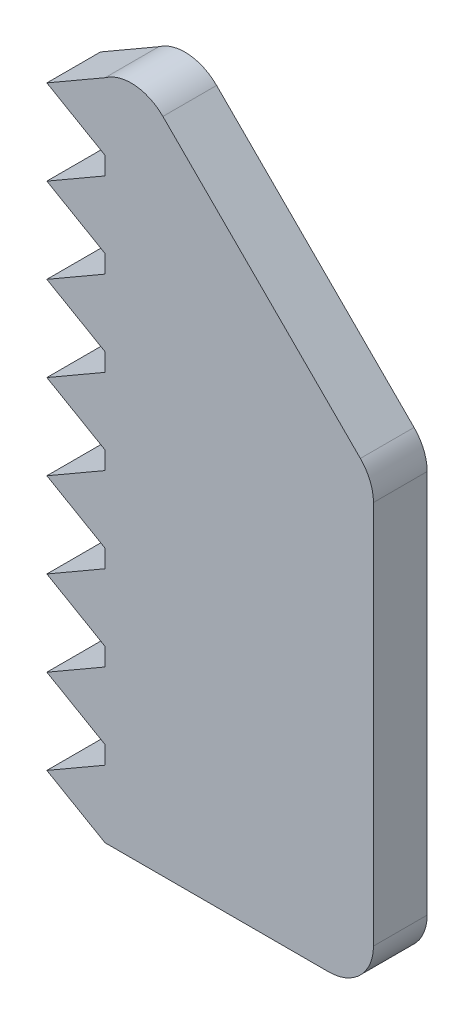
ISO-10303-21;
HEADER;
FILE_DESCRIPTION(('STEP AP214'),'2;1');
FILE_NAME('part.step','',(''),(''),'','','');
FILE_SCHEMA(('AUTOMOTIVE_DESIGN { 1 0 10303 214 1 1 1 1 }'));
ENDSEC;
DATA;
#1=APPLICATION_CONTEXT('core data for automotive mechanical design processes');
#2=APPLICATION_PROTOCOL_DEFINITION('international standard','automotive_design',2000,#1);
#3=PRODUCT_CONTEXT('',#1,'mechanical');
#4=PRODUCT('Part','Part','',(#3));
#5=PRODUCT_RELATED_PRODUCT_CATEGORY('part','',(#4));
#6=PRODUCT_DEFINITION_FORMATION('','',#4);
#7=PRODUCT_DEFINITION_CONTEXT('part definition',#1,'design');
#8=PRODUCT_DEFINITION('design','',#6,#7);
#9=PRODUCT_DEFINITION_SHAPE('','',#8);
#10=(LENGTH_UNIT() NAMED_UNIT(*) SI_UNIT(.MILLI.,.METRE.));
#11=(NAMED_UNIT(*) PLANE_ANGLE_UNIT() SI_UNIT($,.RADIAN.));
#12=(NAMED_UNIT(*) SI_UNIT($,.STERADIAN.) SOLID_ANGLE_UNIT());
#13=UNCERTAINTY_MEASURE_WITH_UNIT(LENGTH_MEASURE(1.E-05),#10,'distance_accuracy_value','');
#14=(GEOMETRIC_REPRESENTATION_CONTEXT(3) GLOBAL_UNCERTAINTY_ASSIGNED_CONTEXT((#13)) GLOBAL_UNIT_ASSIGNED_CONTEXT((#10,
#11,#12)) REPRESENTATION_CONTEXT('',''));
#15=CARTESIAN_POINT('',(0.,0.,0.));
#16=DIRECTION('',(0.,0.,1.));
#17=DIRECTION('',(1.,0.,0.));
#18=AXIS2_PLACEMENT_3D('',#15,#16,#17);
#19=CARTESIAN_POINT('',(0.,20.,3.));
#20=DIRECTION('',(1.,0.,0.));
#21=DIRECTION('',(0.,0.,-1.));
#22=AXIS2_PLACEMENT_3D('',#19,#20,#21);
#23=PLANE('',#22);
#24=DIRECTION('',(0.,-1.,0.));
#25=VECTOR('',#24,1.);
#26=CARTESIAN_POINT('',(0.,20.,3.));
#27=LINE('',#26,#25);
#28=CARTESIAN_POINT('',(0.,86.5388744962558,3.));
#29=VERTEX_POINT('',#28);
#30=CARTESIAN_POINT('',(0.,84.5388744962559,3.));
#31=VERTEX_POINT('',#30);
#32=EDGE_CURVE('E243',#29,#31,#27,.T.);
#33=ORIENTED_EDGE('',*,*,#32,.F.);
#34=DIRECTION('',(0.,0.,1.));
#35=VECTOR('',#34,1.);
#36=CARTESIAN_POINT('',(0.,86.5388744962558,-3.));
#37=LINE('',#36,#35);
#38=CARTESIAN_POINT('',(0.,86.5388744962558,-3.));
#39=VERTEX_POINT('',#38);
#40=EDGE_CURVE('E242',#39,#29,#37,.T.);
#41=ORIENTED_EDGE('',*,*,#40,.F.);
#42=DIRECTION('',(0.,-1.,0.));
#43=VECTOR('',#42,1.);
#44=CARTESIAN_POINT('',(0.,20.,-3.));
#45=LINE('',#44,#43);
#46=CARTESIAN_POINT('',(0.,84.5388744962559,-3.));
#47=VERTEX_POINT('',#46);
#48=EDGE_CURVE('E224',#39,#47,#45,.T.);
#49=ORIENTED_EDGE('',*,*,#48,.T.);
#50=DIRECTION('',(0.,0.,1.));
#51=VECTOR('',#50,1.);
#52=CARTESIAN_POINT('',(0.,84.5388744962559,-3.));
#53=LINE('',#52,#51);
#54=EDGE_CURVE('E277',#47,#31,#53,.T.);
#55=ORIENTED_EDGE('',*,*,#54,.T.);
#56=EDGE_LOOP('',(#33,#41,#49,#55));
#57=FACE_BOUND('',#56,.T.);
#58=ADVANCED_FACE('F32',(#57),#23,.F.);
#59=CARTESIAN_POINT('',(0.,77.0333209967907,3.));
#60=VERTEX_POINT('',#59);
#61=CARTESIAN_POINT('',(0.,75.0333209967907,3.));
#62=VERTEX_POINT('',#61);
#63=EDGE_CURVE('E404',#60,#62,#27,.T.);
#64=ORIENTED_EDGE('',*,*,#63,.F.);
#65=DIRECTION('',(0.,0.,1.));
#66=VECTOR('',#65,1.);
#67=CARTESIAN_POINT('',(0.,77.0333209967907,-3.));
#68=LINE('',#67,#66);
#69=CARTESIAN_POINT('',(0.,77.0333209967907,-3.));
#70=VERTEX_POINT('',#69);
#71=EDGE_CURVE('E269',#70,#60,#68,.T.);
#72=ORIENTED_EDGE('',*,*,#71,.F.);
#73=CARTESIAN_POINT('',(0.,75.0333209967907,-3.));
#74=VERTEX_POINT('',#73);
#75=EDGE_CURVE('E238',#70,#74,#45,.T.);
#76=ORIENTED_EDGE('',*,*,#75,.T.);
#77=DIRECTION('',(0.,0.,1.));
#78=VECTOR('',#77,1.);
#79=CARTESIAN_POINT('',(0.,75.0333209967907,-3.));
#80=LINE('',#79,#78);
#81=EDGE_CURVE('E296',#74,#62,#80,.T.);
#82=ORIENTED_EDGE('',*,*,#81,.T.);
#83=EDGE_LOOP('',(#64,#72,#76,#82));
#84=FACE_BOUND('',#83,.T.);
#85=ADVANCED_FACE('F465',(#84),#23,.F.);
#86=CARTESIAN_POINT('',(0.,67.5277674973256,3.));
#87=VERTEX_POINT('',#86);
#88=CARTESIAN_POINT('',(0.,65.5277674973256,3.));
#89=VERTEX_POINT('',#88);
#90=EDGE_CURVE('E463',#87,#89,#27,.T.);
#91=ORIENTED_EDGE('',*,*,#90,.F.);
#92=DIRECTION('',(0.,0.,1.));
#93=VECTOR('',#92,1.);
#94=CARTESIAN_POINT('',(0.,67.5277674973256,-3.));
#95=LINE('',#94,#93);
#96=CARTESIAN_POINT('',(0.,67.5277674973256,-3.));
#97=VERTEX_POINT('',#96);
#98=EDGE_CURVE('E288',#97,#87,#95,.T.);
#99=ORIENTED_EDGE('',*,*,#98,.F.);
#100=CARTESIAN_POINT('',(0.,65.5277674973256,-3.));
#101=VERTEX_POINT('',#100);
#102=EDGE_CURVE('E479',#97,#101,#45,.T.);
#103=ORIENTED_EDGE('',*,*,#102,.T.);
#104=DIRECTION('',(0.,0.,1.));
#105=VECTOR('',#104,1.);
#106=CARTESIAN_POINT('',(0.,65.5277674973256,-3.));
#107=LINE('',#106,#105);
#108=EDGE_CURVE('E316',#101,#89,#107,.T.);
#109=ORIENTED_EDGE('',*,*,#108,.T.);
#110=EDGE_LOOP('',(#91,#99,#103,#109));
#111=FACE_BOUND('',#110,.T.);
#112=ADVANCED_FACE('F478',(#111),#23,.F.);
#113=CARTESIAN_POINT('',(0.,58.0222139978605,3.));
#114=VERTEX_POINT('',#113);
#115=CARTESIAN_POINT('',(0.,56.0222139978605,3.));
#116=VERTEX_POINT('',#115);
#117=EDGE_CURVE('E476',#114,#116,#27,.T.);
#118=ORIENTED_EDGE('',*,*,#117,.F.);
#119=DIRECTION('',(0.,0.,1.));
#120=VECTOR('',#119,1.);
#121=CARTESIAN_POINT('',(0.,58.0222139978605,-3.));
#122=LINE('',#121,#120);
#123=CARTESIAN_POINT('',(0.,58.0222139978605,-3.));
#124=VERTEX_POINT('',#123);
#125=EDGE_CURVE('E308',#124,#114,#122,.T.);
#126=ORIENTED_EDGE('',*,*,#125,.F.);
#127=CARTESIAN_POINT('',(0.,56.0222139978605,-3.));
#128=VERTEX_POINT('',#127);
#129=EDGE_CURVE('E493',#124,#128,#45,.T.);
#130=ORIENTED_EDGE('',*,*,#129,.T.);
#131=DIRECTION('',(0.,0.,1.));
#132=VECTOR('',#131,1.);
#133=CARTESIAN_POINT('',(0.,56.0222139978605,-3.));
#134=LINE('',#133,#132);
#135=EDGE_CURVE('E336',#128,#116,#134,.T.);
#136=ORIENTED_EDGE('',*,*,#135,.T.);
#137=EDGE_LOOP('',(#118,#126,#130,#136));
#138=FACE_BOUND('',#137,.T.);
#139=ADVANCED_FACE('F492',(#138),#23,.F.);
#140=CARTESIAN_POINT('',(0.,48.5166604983954,3.));
#141=VERTEX_POINT('',#140);
#142=CARTESIAN_POINT('',(0.,46.5166604983954,3.));
#143=VERTEX_POINT('',#142);
#144=EDGE_CURVE('E490',#141,#143,#27,.T.);
#145=ORIENTED_EDGE('',*,*,#144,.F.);
#146=DIRECTION('',(0.,0.,1.));
#147=VECTOR('',#146,1.);
#148=CARTESIAN_POINT('',(0.,48.5166604983954,-3.));
#149=LINE('',#148,#147);
#150=CARTESIAN_POINT('',(0.,48.5166604983954,-3.));
#151=VERTEX_POINT('',#150);
#152=EDGE_CURVE('E328',#151,#141,#149,.T.);
#153=ORIENTED_EDGE('',*,*,#152,.F.);
#154=CARTESIAN_POINT('',(0.,46.5166604983954,-3.));
#155=VERTEX_POINT('',#154);
#156=EDGE_CURVE('E507',#151,#155,#45,.T.);
#157=ORIENTED_EDGE('',*,*,#156,.T.);
#158=DIRECTION('',(0.,0.,1.));
#159=VECTOR('',#158,1.);
#160=CARTESIAN_POINT('',(0.,46.5166604983954,-3.));
#161=LINE('',#160,#159);
#162=EDGE_CURVE('E356',#155,#143,#161,.T.);
#163=ORIENTED_EDGE('',*,*,#162,.T.);
#164=EDGE_LOOP('',(#145,#153,#157,#163));
#165=FACE_BOUND('',#164,.T.);
#166=ADVANCED_FACE('F506',(#165),#23,.F.);
#167=CARTESIAN_POINT('',(0.,39.0111069989302,3.));
#168=VERTEX_POINT('',#167);
#169=CARTESIAN_POINT('',(0.,37.0111069989303,3.));
#170=VERTEX_POINT('',#169);
#171=EDGE_CURVE('E504',#168,#170,#27,.T.);
#172=ORIENTED_EDGE('',*,*,#171,.F.);
#173=DIRECTION('',(0.,0.,1.));
#174=VECTOR('',#173,1.);
#175=CARTESIAN_POINT('',(0.,39.0111069989302,-3.));
#176=LINE('',#175,#174);
#177=CARTESIAN_POINT('',(0.,39.0111069989302,-3.));
#178=VERTEX_POINT('',#177);
#179=EDGE_CURVE('E348',#178,#168,#176,.T.);
#180=ORIENTED_EDGE('',*,*,#179,.F.);
#181=CARTESIAN_POINT('',(0.,37.0111069989303,-3.));
#182=VERTEX_POINT('',#181);
#183=EDGE_CURVE('E520',#178,#182,#45,.T.);
#184=ORIENTED_EDGE('',*,*,#183,.T.);
#185=DIRECTION('',(0.,0.,1.));
#186=VECTOR('',#185,1.);
#187=CARTESIAN_POINT('',(0.,37.0111069989303,-3.));
#188=LINE('',#187,#186);
#189=EDGE_CURVE('E376',#182,#170,#188,.T.);
#190=ORIENTED_EDGE('',*,*,#189,.T.);
#191=EDGE_LOOP('',(#172,#180,#184,#190));
#192=FACE_BOUND('',#191,.T.);
#193=ADVANCED_FACE('F519',(#192),#23,.F.);
#194=CARTESIAN_POINT('',(0.,29.5055534994652,3.));
#195=VERTEX_POINT('',#194);
#196=CARTESIAN_POINT('',(0.,27.5055534994652,3.));
#197=VERTEX_POINT('',#196);
#198=EDGE_CURVE('E400',#195,#197,#27,.T.);
#199=ORIENTED_EDGE('',*,*,#198,.F.);
#200=DIRECTION('',(0.,0.,1.));
#201=VECTOR('',#200,1.);
#202=CARTESIAN_POINT('',(0.,29.5055534994652,-3.));
#203=LINE('',#202,#201);
#204=CARTESIAN_POINT('',(0.,29.5055534994652,-3.));
#205=VERTEX_POINT('',#204);
#206=EDGE_CURVE('E368',#205,#195,#203,.T.);
#207=ORIENTED_EDGE('',*,*,#206,.F.);
#208=CARTESIAN_POINT('',(0.,27.5055534994652,-3.));
#209=VERTEX_POINT('',#208);
#210=EDGE_CURVE('E240',#205,#209,#45,.T.);
#211=ORIENTED_EDGE('',*,*,#210,.T.);
#212=DIRECTION('',(0.,0.,1.));
#213=VECTOR('',#212,1.);
#214=CARTESIAN_POINT('',(0.,27.5055534994652,-3.));
#215=LINE('',#214,#213);
#216=EDGE_CURVE('E387',#209,#197,#215,.T.);
#217=ORIENTED_EDGE('',*,*,#216,.T.);
#218=EDGE_LOOP('',(#199,#207,#211,#217));
#219=FACE_BOUND('',#218,.T.);
#220=ADVANCED_FACE('F536',(#219),#23,.F.);
#221=CARTESIAN_POINT('',(0.,100.,3.));
#222=DIRECTION('',(-0.707106781186551,-0.707106781186544,0.));
#223=DIRECTION('',(0.707106781186544,-0.707106781186551,0.));
#224=AXIS2_PLACEMENT_3D('',#221,#222,#223);
#225=PLANE('',#224);
#226=DIRECTION('',(-0.707106781186544,0.707106781186551,0.));
#227=VECTOR('',#226,1.);
#228=CARTESIAN_POINT('',(0.,100.,-3.));
#229=LINE('',#228,#227);
#230=CARTESIAN_POINT('',(28.5355339059325,71.4644660940672,-3.));
#231=VERTEX_POINT('',#230);
#232=CARTESIAN_POINT('',(6.46904899363904,93.5309510063609,-3.));
#233=VERTEX_POINT('',#232);
#234=EDGE_CURVE('E394',#231,#233,#229,.T.);
#235=ORIENTED_EDGE('',*,*,#234,.T.);
#236=DIRECTION('',(0.,0.,1.));
#237=VECTOR('',#236,1.);
#238=CARTESIAN_POINT('',(6.46904899363904,93.5309510063609,3.));
#239=LINE('',#238,#237);
#240=CARTESIAN_POINT('',(6.46904899363903,93.5309510063609,3.));
#241=VERTEX_POINT('',#240);
#242=EDGE_CURVE('E425',#233,#241,#239,.T.);
#243=ORIENTED_EDGE('',*,*,#242,.T.);
#244=DIRECTION('',(-0.707106781186544,0.707106781186551,0.));
#245=VECTOR('',#244,1.);
#246=CARTESIAN_POINT('',(0.,100.,3.));
#247=LINE('',#246,#245);
#248=CARTESIAN_POINT('',(28.5355339059325,71.4644660940672,3.));
#249=VERTEX_POINT('',#248);
#250=EDGE_CURVE('E397',#249,#241,#247,.T.);
#251=ORIENTED_EDGE('',*,*,#250,.F.);
#252=DIRECTION('',(0.,0.,-1.));
#253=VECTOR('',#252,1.);
#254=CARTESIAN_POINT('',(28.5355339059325,71.4644660940672,3.));
#255=LINE('',#254,#253);
#256=EDGE_CURVE('E422',#249,#231,#255,.T.);
#257=ORIENTED_EDGE('',*,*,#256,.T.);
#258=EDGE_LOOP('',(#235,#243,#251,#257));
#259=FACE_BOUND('',#258,.T.);
#260=ADVANCED_FACE('F444',(#259),#225,.F.);
#261=CARTESIAN_POINT('',(29.9999999999999,20.,3.));
#262=DIRECTION('',(0.,1.,0.));
#263=DIRECTION('',(-1.,0.,0.));
#264=AXIS2_PLACEMENT_3D('',#261,#262,#263);
#265=PLANE('',#264);
#266=DIRECTION('',(1.,0.,0.));
#267=VECTOR('',#266,1.);
#268=CARTESIAN_POINT('',(29.9999999999999,20.,-3.));
#269=LINE('',#268,#267);
#270=CARTESIAN_POINT('',(0.,20.,-3.));
#271=VERTEX_POINT('',#270);
#272=CARTESIAN_POINT('',(24.9999999999999,20.,-3.));
#273=VERTEX_POINT('',#272);
#274=EDGE_CURVE('E237',#271,#273,#269,.T.);
#275=ORIENTED_EDGE('',*,*,#274,.T.);
#276=DIRECTION('',(0.,0.,-1.));
#277=VECTOR('',#276,1.);
#278=CARTESIAN_POINT('',(24.9999999999999,20.,3.));
#279=LINE('',#278,#277);
#280=CARTESIAN_POINT('',(24.9999999999999,20.,3.));
#281=VERTEX_POINT('',#280);
#282=EDGE_CURVE('E11',#273,#281,#279,.F.);
#283=ORIENTED_EDGE('',*,*,#282,.T.);
#284=DIRECTION('',(1.,0.,0.));
#285=VECTOR('',#284,1.);
#286=CARTESIAN_POINT('',(29.9999999999999,20.,3.));
#287=LINE('',#286,#285);
#288=CARTESIAN_POINT('',(0.,20.,3.));
#289=VERTEX_POINT('',#288);
#290=EDGE_CURVE('E403',#289,#281,#287,.T.);
#291=ORIENTED_EDGE('',*,*,#290,.F.);
#292=DIRECTION('',(0.,0.,-1.));
#293=VECTOR('',#292,1.);
#294=CARTESIAN_POINT('',(0.,20.,3.));
#295=LINE('',#294,#293);
#296=EDGE_CURVE('E408',#289,#271,#295,.T.);
#297=ORIENTED_EDGE('',*,*,#296,.T.);
#298=EDGE_LOOP('',(#275,#283,#291,#297));
#299=FACE_BOUND('',#298,.T.);
#300=ADVANCED_FACE('F542',(#299),#265,.F.);
#301=CARTESIAN_POINT('',(29.9999999999997,70.,3.));
#302=DIRECTION('',(-1.,0.,0.));
#303=DIRECTION('',(0.,-1.,0.));
#304=AXIS2_PLACEMENT_3D('',#301,#302,#303);
#305=PLANE('',#304);
#306=DIRECTION('',(0.,1.,0.));
#307=VECTOR('',#306,1.);
#308=CARTESIAN_POINT('',(29.9999999999997,70.,3.));
#309=LINE('',#308,#307);
#310=CARTESIAN_POINT('',(29.9999999999999,25.,3.));
#311=VERTEX_POINT('',#310);
#312=CARTESIAN_POINT('',(29.9999999999997,67.9289321881345,3.));
#313=VERTEX_POINT('',#312);
#314=EDGE_CURVE('E406',#311,#313,#309,.T.);
#315=ORIENTED_EDGE('',*,*,#314,.F.);
#316=DIRECTION('',(0.,0.,-1.));
#317=VECTOR('',#316,1.);
#318=CARTESIAN_POINT('',(29.9999999999999,25.,3.));
#319=LINE('',#318,#317);
#320=CARTESIAN_POINT('',(29.9999999999999,25.,-3.));
#321=VERTEX_POINT('',#320);
#322=EDGE_CURVE('E40',#311,#321,#319,.T.);
#323=ORIENTED_EDGE('',*,*,#322,.T.);
#324=DIRECTION('',(0.,1.,0.));
#325=VECTOR('',#324,1.);
#326=CARTESIAN_POINT('',(29.9999999999997,70.,-3.));
#327=LINE('',#326,#325);
#328=CARTESIAN_POINT('',(29.9999999999997,67.9289321881345,-3.));
#329=VERTEX_POINT('',#328);
#330=EDGE_CURVE('E401',#321,#329,#327,.T.);
#331=ORIENTED_EDGE('',*,*,#330,.T.);
#332=DIRECTION('',(0.,0.,-1.));
#333=VECTOR('',#332,1.);
#334=CARTESIAN_POINT('',(29.9999999999997,67.9289321881345,3.));
#335=LINE('',#334,#333);
#336=EDGE_CURVE('E47',#329,#313,#335,.F.);
#337=ORIENTED_EDGE('',*,*,#336,.T.);
#338=EDGE_LOOP('',(#315,#323,#331,#337));
#339=FACE_BOUND('',#338,.T.);
#340=ADVANCED_FACE('F435',(#339),#305,.F.);
#341=CARTESIAN_POINT('',(0.,0.,3.));
#342=DIRECTION('',(0.,0.,-1.));
#343=DIRECTION('',(-1.,0.,0.));
#344=AXIS2_PLACEMENT_3D('',#341,#342,#343);
#345=PLANE('',#344);
#346=ORIENTED_EDGE('',*,*,#250,.T.);
#347=CARTESIAN_POINT('',(2.93351508770628,89.9954171004282,3.));
#348=DIRECTION('',(0.,0.,-1.));
#349=DIRECTION('',(-1.,0.,0.));
#350=AXIS2_PLACEMENT_3D('',#347,#348,#349);
#351=CIRCLE('',#350,5.);
#352=CARTESIAN_POINT('',(0.,94.044427995721,3.));
#353=VERTEX_POINT('',#352);
#354=EDGE_CURVE('E430',#241,#353,#351,.F.);
#355=ORIENTED_EDGE('',*,*,#354,.T.);
#356=DIRECTION('',(-0.866025403784439,-0.5,0.));
#357=VECTOR('',#356,1.);
#358=CARTESIAN_POINT('',(-6.5,90.2916512459884,3.));
#359=LINE('',#358,#357);
#360=CARTESIAN_POINT('',(-6.5,90.2916512459884,3.));
#361=VERTEX_POINT('',#360);
#362=EDGE_CURVE('E252',#353,#361,#359,.T.);
#363=ORIENTED_EDGE('',*,*,#362,.T.);
#364=DIRECTION('',(0.866025403784439,-0.5,0.));
#365=VECTOR('',#364,1.);
#366=CARTESIAN_POINT('',(0.,86.5388744962558,3.));
#367=LINE('',#366,#365);
#368=EDGE_CURVE('E256',#361,#29,#367,.T.);
#369=ORIENTED_EDGE('',*,*,#368,.T.);
#370=ORIENTED_EDGE('',*,*,#32,.T.);
#371=DIRECTION('',(-0.866025403784438,-0.500000000000001,0.));
#372=VECTOR('',#371,1.);
#373=CARTESIAN_POINT('',(-6.5,80.7860977465233,3.));
#374=LINE('',#373,#372);
#375=CARTESIAN_POINT('',(-6.5,80.7860977465233,3.));
#376=VERTEX_POINT('',#375);
#377=EDGE_CURVE('E267',#31,#376,#374,.T.);
#378=ORIENTED_EDGE('',*,*,#377,.T.);
#379=DIRECTION('',(0.866025403784439,-0.5,0.));
#380=VECTOR('',#379,1.);
#381=CARTESIAN_POINT('',(0.,77.0333209967907,3.));
#382=LINE('',#381,#380);
#383=EDGE_CURVE('E261',#376,#60,#382,.T.);
#384=ORIENTED_EDGE('',*,*,#383,.T.);
#385=ORIENTED_EDGE('',*,*,#63,.T.);
#386=DIRECTION('',(-0.866025403784439,-0.5,0.));
#387=VECTOR('',#386,1.);
#388=CARTESIAN_POINT('',(-6.5,71.2805442470582,3.));
#389=LINE('',#388,#387);
#390=CARTESIAN_POINT('',(-6.5,71.2805442470582,3.));
#391=VERTEX_POINT('',#390);
#392=EDGE_CURVE('E285',#62,#391,#389,.T.);
#393=ORIENTED_EDGE('',*,*,#392,.T.);
#394=DIRECTION('',(0.866025403784439,-0.5,0.));
#395=VECTOR('',#394,1.);
#396=CARTESIAN_POINT('',(0.,67.5277674973256,3.));
#397=LINE('',#396,#395);
#398=EDGE_CURVE('E276',#391,#87,#397,.T.);
#399=ORIENTED_EDGE('',*,*,#398,.T.);
#400=ORIENTED_EDGE('',*,*,#90,.T.);
#401=DIRECTION('',(-0.866025403784439,-0.5,0.));
#402=VECTOR('',#401,1.);
#403=CARTESIAN_POINT('',(-6.5,61.774990747593,3.));
#404=LINE('',#403,#402);
#405=CARTESIAN_POINT('',(-6.5,61.774990747593,3.));
#406=VERTEX_POINT('',#405);
#407=EDGE_CURVE('E305',#89,#406,#404,.T.);
#408=ORIENTED_EDGE('',*,*,#407,.T.);
#409=DIRECTION('',(0.866025403784439,-0.5,0.));
#410=VECTOR('',#409,1.);
#411=CARTESIAN_POINT('',(0.,58.0222139978605,3.));
#412=LINE('',#411,#410);
#413=EDGE_CURVE('E295',#406,#114,#412,.T.);
#414=ORIENTED_EDGE('',*,*,#413,.T.);
#415=ORIENTED_EDGE('',*,*,#117,.T.);
#416=DIRECTION('',(-0.866025403784439,-0.5,0.));
#417=VECTOR('',#416,1.);
#418=CARTESIAN_POINT('',(-6.5,52.2694372481279,3.));
#419=LINE('',#418,#417);
#420=CARTESIAN_POINT('',(-6.5,52.2694372481279,3.));
#421=VERTEX_POINT('',#420);
#422=EDGE_CURVE('E325',#116,#421,#419,.T.);
#423=ORIENTED_EDGE('',*,*,#422,.T.);
#424=DIRECTION('',(0.866025403784439,-0.5,0.));
#425=VECTOR('',#424,1.);
#426=CARTESIAN_POINT('',(0.,48.5166604983954,3.));
#427=LINE('',#426,#425);
#428=EDGE_CURVE('E315',#421,#141,#427,.T.);
#429=ORIENTED_EDGE('',*,*,#428,.T.);
#430=ORIENTED_EDGE('',*,*,#144,.T.);
#431=DIRECTION('',(-0.866025403784438,-0.5,0.));
#432=VECTOR('',#431,1.);
#433=CARTESIAN_POINT('',(-6.5,42.7638837486628,3.));
#434=LINE('',#433,#432);
#435=CARTESIAN_POINT('',(-6.5,42.7638837486628,3.));
#436=VERTEX_POINT('',#435);
#437=EDGE_CURVE('E345',#143,#436,#434,.T.);
#438=ORIENTED_EDGE('',*,*,#437,.T.);
#439=DIRECTION('',(0.866025403784439,-0.5,0.));
#440=VECTOR('',#439,1.);
#441=CARTESIAN_POINT('',(0.,39.0111069989302,3.));
#442=LINE('',#441,#440);
#443=EDGE_CURVE('E335',#436,#168,#442,.T.);
#444=ORIENTED_EDGE('',*,*,#443,.T.);
#445=ORIENTED_EDGE('',*,*,#171,.T.);
#446=DIRECTION('',(-0.866025403784439,-0.5,0.));
#447=VECTOR('',#446,1.);
#448=CARTESIAN_POINT('',(-6.5,33.2583302491977,3.));
#449=LINE('',#448,#447);
#450=CARTESIAN_POINT('',(-6.5,33.2583302491977,3.));
#451=VERTEX_POINT('',#450);
#452=EDGE_CURVE('E365',#170,#451,#449,.T.);
#453=ORIENTED_EDGE('',*,*,#452,.T.);
#454=DIRECTION('',(0.86602540378444,-0.499999999999998,0.));
#455=VECTOR('',#454,1.);
#456=CARTESIAN_POINT('',(0.,29.5055534994652,3.));
#457=LINE('',#456,#455);
#458=EDGE_CURVE('E355',#451,#195,#457,.T.);
#459=ORIENTED_EDGE('',*,*,#458,.T.);
#460=ORIENTED_EDGE('',*,*,#198,.T.);
#461=DIRECTION('',(-0.866025403784439,-0.5,0.));
#462=VECTOR('',#461,1.);
#463=CARTESIAN_POINT('',(-6.5,23.7527767497326,3.));
#464=LINE('',#463,#462);
#465=CARTESIAN_POINT('',(-6.5,23.7527767497326,3.));
#466=VERTEX_POINT('',#465);
#467=EDGE_CURVE('E375',#197,#466,#464,.T.);
#468=ORIENTED_EDGE('',*,*,#467,.T.);
#469=DIRECTION('',(0.866025403784439,-0.5,0.));
#470=VECTOR('',#469,1.);
#471=CARTESIAN_POINT('',(0.,20.,3.));
#472=LINE('',#471,#470);
#473=EDGE_CURVE('E385',#466,#289,#472,.T.);
#474=ORIENTED_EDGE('',*,*,#473,.T.);
#475=ORIENTED_EDGE('',*,*,#290,.T.);
#476=CARTESIAN_POINT('',(24.9999999999999,25.,3.));
#477=DIRECTION('',(0.,0.,-1.));
#478=DIRECTION('',(-1.,0.,0.));
#479=AXIS2_PLACEMENT_3D('',#476,#477,#478);
#480=CIRCLE('',#479,5.);
#481=EDGE_CURVE('E54',#281,#311,#480,.F.);
#482=ORIENTED_EDGE('',*,*,#481,.T.);
#483=ORIENTED_EDGE('',*,*,#314,.T.);
#484=CARTESIAN_POINT('',(24.9999999999997,67.9289321881345,3.));
#485=DIRECTION('',(0.,0.,-1.));
#486=DIRECTION('',(-1.,0.,0.));
#487=AXIS2_PLACEMENT_3D('',#484,#485,#486);
#488=CIRCLE('',#487,5.);
#489=EDGE_CURVE('E427',#313,#249,#488,.F.);
#490=ORIENTED_EDGE('',*,*,#489,.T.);
#491=EDGE_LOOP('',(#346,#355,#363,#369,#370,#378,#384,#385,#393,#399,#400,#408,#414,#415,#423,
#429,#430,#438,#444,#445,#453,#459,#460,#468,#474,#475,#482,#483,#490));
#492=FACE_BOUND('',#491,.T.);
#493=ADVANCED_FACE('F447',(#492),#345,.F.);
#494=CARTESIAN_POINT('',(0.,0.,-3.));
#495=DIRECTION('',(0.,0.,-1.));
#496=DIRECTION('',(-1.,0.,0.));
#497=AXIS2_PLACEMENT_3D('',#494,#495,#496);
#498=PLANE('',#497);
#499=DIRECTION('',(-0.866025403784439,-0.5,0.));
#500=VECTOR('',#499,1.);
#501=CARTESIAN_POINT('',(-6.5,90.2916512459884,-3.));
#502=LINE('',#501,#500);
#503=CARTESIAN_POINT('',(0.,94.044427995721,-3.));
#504=VERTEX_POINT('',#503);
#505=CARTESIAN_POINT('',(-6.5,90.2916512459884,-3.));
#506=VERTEX_POINT('',#505);
#507=EDGE_CURVE('E248',#504,#506,#502,.T.);
#508=ORIENTED_EDGE('',*,*,#507,.F.);
#509=CARTESIAN_POINT('',(2.93351508770628,89.9954171004282,-3.));
#510=DIRECTION('',(0.,0.,-1.));
#511=DIRECTION('',(-1.,0.,0.));
#512=AXIS2_PLACEMENT_3D('',#509,#510,#511);
#513=CIRCLE('',#512,5.);
#514=EDGE_CURVE('E420',#504,#233,#513,.T.);
#515=ORIENTED_EDGE('',*,*,#514,.T.);
#516=ORIENTED_EDGE('',*,*,#234,.F.);
#517=CARTESIAN_POINT('',(24.9999999999997,67.9289321881345,-3.));
#518=DIRECTION('',(0.,0.,-1.));
#519=DIRECTION('',(-1.,0.,0.));
#520=AXIS2_PLACEMENT_3D('',#517,#518,#519);
#521=CIRCLE('',#520,5.);
#522=EDGE_CURVE('E416',#231,#329,#521,.T.);
#523=ORIENTED_EDGE('',*,*,#522,.T.);
#524=ORIENTED_EDGE('',*,*,#330,.F.);
#525=CARTESIAN_POINT('',(24.9999999999999,25.,-3.));
#526=DIRECTION('',(0.,0.,-1.));
#527=DIRECTION('',(-1.,0.,0.));
#528=AXIS2_PLACEMENT_3D('',#525,#526,#527);
#529=CIRCLE('',#528,5.);
#530=EDGE_CURVE('E418',#321,#273,#529,.T.);
#531=ORIENTED_EDGE('',*,*,#530,.T.);
#532=ORIENTED_EDGE('',*,*,#274,.F.);
#533=DIRECTION('',(0.866025403784439,-0.5,0.));
#534=VECTOR('',#533,1.);
#535=CARTESIAN_POINT('',(0.,20.,-3.));
#536=LINE('',#535,#534);
#537=CARTESIAN_POINT('',(-6.5,23.7527767497326,-3.));
#538=VERTEX_POINT('',#537);
#539=EDGE_CURVE('E384',#538,#271,#536,.T.);
#540=ORIENTED_EDGE('',*,*,#539,.F.);
#541=DIRECTION('',(-0.866025403784439,-0.5,0.));
#542=VECTOR('',#541,1.);
#543=CARTESIAN_POINT('',(-6.5,23.7527767497326,-3.));
#544=LINE('',#543,#542);
#545=EDGE_CURVE('E381',#209,#538,#544,.T.);
#546=ORIENTED_EDGE('',*,*,#545,.F.);
#547=ORIENTED_EDGE('',*,*,#210,.F.);
#548=DIRECTION('',(0.86602540378444,-0.499999999999998,0.));
#549=VECTOR('',#548,1.);
#550=CARTESIAN_POINT('',(0.,29.5055534994652,-3.));
#551=LINE('',#550,#549);
#552=CARTESIAN_POINT('',(-6.5,33.2583302491977,-3.));
#553=VERTEX_POINT('',#552);
#554=EDGE_CURVE('E361',#553,#205,#551,.T.);
#555=ORIENTED_EDGE('',*,*,#554,.F.);
#556=DIRECTION('',(-0.866025403784439,-0.5,0.));
#557=VECTOR('',#556,1.);
#558=CARTESIAN_POINT('',(-6.5,33.2583302491977,-3.));
#559=LINE('',#558,#557);
#560=EDGE_CURVE('E364',#182,#553,#559,.T.);
#561=ORIENTED_EDGE('',*,*,#560,.F.);
#562=ORIENTED_EDGE('',*,*,#183,.F.);
#563=DIRECTION('',(0.866025403784439,-0.5,0.));
#564=VECTOR('',#563,1.);
#565=CARTESIAN_POINT('',(0.,39.0111069989302,-3.));
#566=LINE('',#565,#564);
#567=CARTESIAN_POINT('',(-6.5,42.7638837486628,-3.));
#568=VERTEX_POINT('',#567);
#569=EDGE_CURVE('E341',#568,#178,#566,.T.);
#570=ORIENTED_EDGE('',*,*,#569,.F.);
#571=DIRECTION('',(-0.866025403784438,-0.5,0.));
#572=VECTOR('',#571,1.);
#573=CARTESIAN_POINT('',(-6.5,42.7638837486628,-3.));
#574=LINE('',#573,#572);
#575=EDGE_CURVE('E344',#155,#568,#574,.T.);
#576=ORIENTED_EDGE('',*,*,#575,.F.);
#577=ORIENTED_EDGE('',*,*,#156,.F.);
#578=DIRECTION('',(0.866025403784439,-0.5,0.));
#579=VECTOR('',#578,1.);
#580=CARTESIAN_POINT('',(0.,48.5166604983954,-3.));
#581=LINE('',#580,#579);
#582=CARTESIAN_POINT('',(-6.5,52.2694372481279,-3.));
#583=VERTEX_POINT('',#582);
#584=EDGE_CURVE('E321',#583,#151,#581,.T.);
#585=ORIENTED_EDGE('',*,*,#584,.F.);
#586=DIRECTION('',(-0.866025403784439,-0.5,0.));
#587=VECTOR('',#586,1.);
#588=CARTESIAN_POINT('',(-6.5,52.2694372481279,-3.));
#589=LINE('',#588,#587);
#590=EDGE_CURVE('E324',#128,#583,#589,.T.);
#591=ORIENTED_EDGE('',*,*,#590,.F.);
#592=ORIENTED_EDGE('',*,*,#129,.F.);
#593=DIRECTION('',(0.866025403784439,-0.5,0.));
#594=VECTOR('',#593,1.);
#595=CARTESIAN_POINT('',(0.,58.0222139978605,-3.));
#596=LINE('',#595,#594);
#597=CARTESIAN_POINT('',(-6.5,61.774990747593,-3.));
#598=VERTEX_POINT('',#597);
#599=EDGE_CURVE('E301',#598,#124,#596,.T.);
#600=ORIENTED_EDGE('',*,*,#599,.F.);
#601=DIRECTION('',(-0.866025403784439,-0.5,0.));
#602=VECTOR('',#601,1.);
#603=CARTESIAN_POINT('',(-6.5,61.774990747593,-3.));
#604=LINE('',#603,#602);
#605=EDGE_CURVE('E304',#101,#598,#604,.T.);
#606=ORIENTED_EDGE('',*,*,#605,.F.);
#607=ORIENTED_EDGE('',*,*,#102,.F.);
#608=DIRECTION('',(0.866025403784439,-0.5,0.));
#609=VECTOR('',#608,1.);
#610=CARTESIAN_POINT('',(0.,67.5277674973256,-3.));
#611=LINE('',#610,#609);
#612=CARTESIAN_POINT('',(-6.5,71.2805442470582,-3.));
#613=VERTEX_POINT('',#612);
#614=EDGE_CURVE('E281',#613,#97,#611,.T.);
#615=ORIENTED_EDGE('',*,*,#614,.F.);
#616=DIRECTION('',(-0.866025403784439,-0.5,0.));
#617=VECTOR('',#616,1.);
#618=CARTESIAN_POINT('',(-6.5,71.2805442470582,-3.));
#619=LINE('',#618,#617);
#620=EDGE_CURVE('E284',#74,#613,#619,.T.);
#621=ORIENTED_EDGE('',*,*,#620,.F.);
#622=ORIENTED_EDGE('',*,*,#75,.F.);
#623=DIRECTION('',(0.866025403784439,-0.5,0.));
#624=VECTOR('',#623,1.);
#625=CARTESIAN_POINT('',(0.,77.0333209967907,-3.));
#626=LINE('',#625,#624);
#627=CARTESIAN_POINT('',(-6.5,80.7860977465233,-3.));
#628=VERTEX_POINT('',#627);
#629=EDGE_CURVE('E264',#628,#70,#626,.T.);
#630=ORIENTED_EDGE('',*,*,#629,.F.);
#631=DIRECTION('',(-0.866025403784438,-0.500000000000001,0.));
#632=VECTOR('',#631,1.);
#633=CARTESIAN_POINT('',(-6.5,80.7860977465233,-3.));
#634=LINE('',#633,#632);
#635=EDGE_CURVE('E233',#47,#628,#634,.T.);
#636=ORIENTED_EDGE('',*,*,#635,.F.);
#637=ORIENTED_EDGE('',*,*,#48,.F.);
#638=DIRECTION('',(0.866025403784439,-0.5,0.));
#639=VECTOR('',#638,1.);
#640=CARTESIAN_POINT('',(0.,86.5388744962558,-3.));
#641=LINE('',#640,#639);
#642=EDGE_CURVE('E229',#506,#39,#641,.T.);
#643=ORIENTED_EDGE('',*,*,#642,.F.);
#644=EDGE_LOOP('',(#508,#515,#516,#523,#524,#531,#532,#540,#546,#547,#555,#561,#562,#570,#576,
#577,#585,#591,#592,#600,#606,#607,#615,#621,#622,#630,#636,#637,#643));
#645=FACE_BOUND('',#644,.T.);
#646=ADVANCED_FACE('F227',(#645),#498,.T.);
#647=CARTESIAN_POINT('',(0.,20.,-3.));
#648=DIRECTION('',(-0.5,-0.866025403784439,0.));
#649=DIRECTION('',(0.866025403784439,-0.5,0.));
#650=AXIS2_PLACEMENT_3D('',#647,#648,#649);
#651=PLANE('',#650);
#652=ORIENTED_EDGE('',*,*,#473,.F.);
#653=DIRECTION('',(0.,0.,1.));
#654=VECTOR('',#653,1.);
#655=CARTESIAN_POINT('',(-6.5,23.7527767497326,-3.));
#656=LINE('',#655,#654);
#657=EDGE_CURVE('E392',#538,#466,#656,.T.);
#658=ORIENTED_EDGE('',*,*,#657,.F.);
#659=ORIENTED_EDGE('',*,*,#539,.T.);
#660=ORIENTED_EDGE('',*,*,#296,.F.);
#661=EDGE_LOOP('',(#652,#658,#659,#660));
#662=FACE_BOUND('',#661,.T.);
#663=ADVANCED_FACE('F539',(#662),#651,.T.);
#664=CARTESIAN_POINT('',(-6.5,23.7527767497326,-3.));
#665=DIRECTION('',(-0.5,0.866025403784438,0.));
#666=DIRECTION('',(-0.866025403784439,-0.5,0.));
#667=AXIS2_PLACEMENT_3D('',#664,#665,#666);
#668=PLANE('',#667);
#669=ORIENTED_EDGE('',*,*,#467,.F.);
#670=ORIENTED_EDGE('',*,*,#216,.F.);
#671=ORIENTED_EDGE('',*,*,#545,.T.);
#672=ORIENTED_EDGE('',*,*,#657,.T.);
#673=EDGE_LOOP('',(#669,#670,#671,#672));
#674=FACE_BOUND('',#673,.T.);
#675=ADVANCED_FACE('F534',(#674),#668,.T.);
#676=CARTESIAN_POINT('',(0.,29.5055534994652,-3.));
#677=DIRECTION('',(-0.499999999999998,-0.86602540378444,0.));
#678=DIRECTION('',(0.86602540378444,-0.499999999999998,0.));
#679=AXIS2_PLACEMENT_3D('',#676,#677,#678);
#680=PLANE('',#679);
#681=ORIENTED_EDGE('',*,*,#458,.F.);
#682=DIRECTION('',(0.,0.,1.));
#683=VECTOR('',#682,1.);
#684=CARTESIAN_POINT('',(-6.5,33.2583302491977,-3.));
#685=LINE('',#684,#683);
#686=EDGE_CURVE('E373',#553,#451,#685,.T.);
#687=ORIENTED_EDGE('',*,*,#686,.F.);
#688=ORIENTED_EDGE('',*,*,#554,.T.);
#689=ORIENTED_EDGE('',*,*,#206,.T.);
#690=EDGE_LOOP('',(#681,#687,#688,#689));
#691=FACE_BOUND('',#690,.T.);
#692=ADVANCED_FACE('F527',(#691),#680,.T.);
#693=CARTESIAN_POINT('',(-6.5,33.2583302491977,-3.));
#694=DIRECTION('',(-0.5,0.866025403784439,0.));
#695=DIRECTION('',(-0.866025403784439,-0.5,0.));
#696=AXIS2_PLACEMENT_3D('',#693,#694,#695);
#697=PLANE('',#696);
#698=ORIENTED_EDGE('',*,*,#452,.F.);
#699=ORIENTED_EDGE('',*,*,#189,.F.);
#700=ORIENTED_EDGE('',*,*,#560,.T.);
#701=ORIENTED_EDGE('',*,*,#686,.T.);
#702=EDGE_LOOP('',(#698,#699,#700,#701));
#703=FACE_BOUND('',#702,.T.);
#704=ADVANCED_FACE('F523',(#703),#697,.T.);
#705=CARTESIAN_POINT('',(0.,39.0111069989302,-3.));
#706=DIRECTION('',(-0.5,-0.866025403784439,0.));
#707=DIRECTION('',(0.866025403784439,-0.5,0.));
#708=AXIS2_PLACEMENT_3D('',#705,#706,#707);
#709=PLANE('',#708);
#710=ORIENTED_EDGE('',*,*,#443,.F.);
#711=DIRECTION('',(0.,0.,1.));
#712=VECTOR('',#711,1.);
#713=CARTESIAN_POINT('',(-6.5,42.7638837486628,-3.));
#714=LINE('',#713,#712);
#715=EDGE_CURVE('E353',#568,#436,#714,.T.);
#716=ORIENTED_EDGE('',*,*,#715,.F.);
#717=ORIENTED_EDGE('',*,*,#569,.T.);
#718=ORIENTED_EDGE('',*,*,#179,.T.);
#719=EDGE_LOOP('',(#710,#716,#717,#718));
#720=FACE_BOUND('',#719,.T.);
#721=ADVANCED_FACE('F514',(#720),#709,.T.);
#722=CARTESIAN_POINT('',(-6.5,42.7638837486628,-3.));
#723=DIRECTION('',(-0.500000000000001,0.866025403784438,0.));
#724=DIRECTION('',(-0.866025403784438,-0.500000000000001,0.));
#725=AXIS2_PLACEMENT_3D('',#722,#723,#724);
#726=PLANE('',#725);
#727=ORIENTED_EDGE('',*,*,#437,.F.);
#728=ORIENTED_EDGE('',*,*,#162,.F.);
#729=ORIENTED_EDGE('',*,*,#575,.T.);
#730=ORIENTED_EDGE('',*,*,#715,.T.);
#731=EDGE_LOOP('',(#727,#728,#729,#730));
#732=FACE_BOUND('',#731,.T.);
#733=ADVANCED_FACE('F510',(#732),#726,.T.);
#734=CARTESIAN_POINT('',(0.,48.5166604983954,-3.));
#735=DIRECTION('',(-0.5,-0.866025403784439,0.));
#736=DIRECTION('',(0.866025403784439,-0.5,0.));
#737=AXIS2_PLACEMENT_3D('',#734,#735,#736);
#738=PLANE('',#737);
#739=ORIENTED_EDGE('',*,*,#428,.F.);
#740=DIRECTION('',(0.,0.,1.));
#741=VECTOR('',#740,1.);
#742=CARTESIAN_POINT('',(-6.5,52.2694372481279,-3.));
#743=LINE('',#742,#741);
#744=EDGE_CURVE('E333',#583,#421,#743,.T.);
#745=ORIENTED_EDGE('',*,*,#744,.F.);
#746=ORIENTED_EDGE('',*,*,#584,.T.);
#747=ORIENTED_EDGE('',*,*,#152,.T.);
#748=EDGE_LOOP('',(#739,#745,#746,#747));
#749=FACE_BOUND('',#748,.T.);
#750=ADVANCED_FACE('F500',(#749),#738,.T.);
#751=CARTESIAN_POINT('',(-6.5,52.2694372481279,-3.));
#752=DIRECTION('',(-0.5,0.866025403784439,0.));
#753=DIRECTION('',(-0.866025403784439,-0.5,0.));
#754=AXIS2_PLACEMENT_3D('',#751,#752,#753);
#755=PLANE('',#754);
#756=ORIENTED_EDGE('',*,*,#422,.F.);
#757=ORIENTED_EDGE('',*,*,#135,.F.);
#758=ORIENTED_EDGE('',*,*,#590,.T.);
#759=ORIENTED_EDGE('',*,*,#744,.T.);
#760=EDGE_LOOP('',(#756,#757,#758,#759));
#761=FACE_BOUND('',#760,.T.);
#762=ADVANCED_FACE('F496',(#761),#755,.T.);
#763=CARTESIAN_POINT('',(0.,58.0222139978605,-3.));
#764=DIRECTION('',(-0.5,-0.866025403784439,0.));
#765=DIRECTION('',(0.866025403784439,-0.5,0.));
#766=AXIS2_PLACEMENT_3D('',#763,#764,#765);
#767=PLANE('',#766);
#768=ORIENTED_EDGE('',*,*,#413,.F.);
#769=DIRECTION('',(0.,0.,1.));
#770=VECTOR('',#769,1.);
#771=CARTESIAN_POINT('',(-6.5,61.774990747593,-3.));
#772=LINE('',#771,#770);
#773=EDGE_CURVE('E313',#598,#406,#772,.T.);
#774=ORIENTED_EDGE('',*,*,#773,.F.);
#775=ORIENTED_EDGE('',*,*,#599,.T.);
#776=ORIENTED_EDGE('',*,*,#125,.T.);
#777=EDGE_LOOP('',(#768,#774,#775,#776));
#778=FACE_BOUND('',#777,.T.);
#779=ADVANCED_FACE('F486',(#778),#767,.T.);
#780=CARTESIAN_POINT('',(-6.5,61.774990747593,-3.));
#781=DIRECTION('',(-0.5,0.866025403784439,0.));
#782=DIRECTION('',(-0.866025403784439,-0.5,0.));
#783=AXIS2_PLACEMENT_3D('',#780,#781,#782);
#784=PLANE('',#783);
#785=ORIENTED_EDGE('',*,*,#407,.F.);
#786=ORIENTED_EDGE('',*,*,#108,.F.);
#787=ORIENTED_EDGE('',*,*,#605,.T.);
#788=ORIENTED_EDGE('',*,*,#773,.T.);
#789=EDGE_LOOP('',(#785,#786,#787,#788));
#790=FACE_BOUND('',#789,.T.);
#791=ADVANCED_FACE('F482',(#790),#784,.T.);
#792=CARTESIAN_POINT('',(0.,67.5277674973256,-3.));
#793=DIRECTION('',(-0.5,-0.866025403784439,0.));
#794=DIRECTION('',(0.866025403784439,-0.5,0.));
#795=AXIS2_PLACEMENT_3D('',#792,#793,#794);
#796=PLANE('',#795);
#797=ORIENTED_EDGE('',*,*,#398,.F.);
#798=DIRECTION('',(0.,0.,1.));
#799=VECTOR('',#798,1.);
#800=CARTESIAN_POINT('',(-6.5,71.2805442470582,-3.));
#801=LINE('',#800,#799);
#802=EDGE_CURVE('E293',#613,#391,#801,.T.);
#803=ORIENTED_EDGE('',*,*,#802,.F.);
#804=ORIENTED_EDGE('',*,*,#614,.T.);
#805=ORIENTED_EDGE('',*,*,#98,.T.);
#806=EDGE_LOOP('',(#797,#803,#804,#805));
#807=FACE_BOUND('',#806,.T.);
#808=ADVANCED_FACE('F472',(#807),#796,.T.);
#809=CARTESIAN_POINT('',(-6.5,71.2805442470582,-3.));
#810=DIRECTION('',(-0.5,0.866025403784439,0.));
#811=DIRECTION('',(-0.866025403784439,-0.5,0.));
#812=AXIS2_PLACEMENT_3D('',#809,#810,#811);
#813=PLANE('',#812);
#814=ORIENTED_EDGE('',*,*,#392,.F.);
#815=ORIENTED_EDGE('',*,*,#81,.F.);
#816=ORIENTED_EDGE('',*,*,#620,.T.);
#817=ORIENTED_EDGE('',*,*,#802,.T.);
#818=EDGE_LOOP('',(#814,#815,#816,#817));
#819=FACE_BOUND('',#818,.T.);
#820=ADVANCED_FACE('F468',(#819),#813,.T.);
#821=CARTESIAN_POINT('',(0.,77.0333209967907,-3.));
#822=DIRECTION('',(-0.5,-0.866025403784439,0.));
#823=DIRECTION('',(0.866025403784439,-0.5,0.));
#824=AXIS2_PLACEMENT_3D('',#821,#822,#823);
#825=PLANE('',#824);
#826=ORIENTED_EDGE('',*,*,#383,.F.);
#827=DIRECTION('',(0.,0.,1.));
#828=VECTOR('',#827,1.);
#829=CARTESIAN_POINT('',(-6.5,80.7860977465233,-3.));
#830=LINE('',#829,#828);
#831=EDGE_CURVE('E274',#628,#376,#830,.T.);
#832=ORIENTED_EDGE('',*,*,#831,.F.);
#833=ORIENTED_EDGE('',*,*,#629,.T.);
#834=ORIENTED_EDGE('',*,*,#71,.T.);
#835=EDGE_LOOP('',(#826,#832,#833,#834));
#836=FACE_BOUND('',#835,.T.);
#837=ADVANCED_FACE('F459',(#836),#825,.T.);
#838=CARTESIAN_POINT('',(-6.5,80.7860977465233,-3.));
#839=DIRECTION('',(-0.500000000000001,0.866025403784438,0.));
#840=DIRECTION('',(-0.866025403784438,-0.500000000000001,0.));
#841=AXIS2_PLACEMENT_3D('',#838,#839,#840);
#842=PLANE('',#841);
#843=ORIENTED_EDGE('',*,*,#377,.F.);
#844=ORIENTED_EDGE('',*,*,#54,.F.);
#845=ORIENTED_EDGE('',*,*,#635,.T.);
#846=ORIENTED_EDGE('',*,*,#831,.T.);
#847=EDGE_LOOP('',(#843,#844,#845,#846));
#848=FACE_BOUND('',#847,.T.);
#849=ADVANCED_FACE('F456',(#848),#842,.T.);
#850=CARTESIAN_POINT('',(0.,86.5388744962558,-3.));
#851=DIRECTION('',(-0.5,-0.866025403784439,0.));
#852=DIRECTION('',(0.866025403784439,-0.5,0.));
#853=AXIS2_PLACEMENT_3D('',#850,#851,#852);
#854=PLANE('',#853);
#855=ORIENTED_EDGE('',*,*,#368,.F.);
#856=DIRECTION('',(0.,0.,1.));
#857=VECTOR('',#856,1.);
#858=CARTESIAN_POINT('',(-6.5,90.2916512459884,-3.));
#859=LINE('',#858,#857);
#860=EDGE_CURVE('E251',#506,#361,#859,.T.);
#861=ORIENTED_EDGE('',*,*,#860,.F.);
#862=ORIENTED_EDGE('',*,*,#642,.T.);
#863=ORIENTED_EDGE('',*,*,#40,.T.);
#864=EDGE_LOOP('',(#855,#861,#862,#863));
#865=FACE_BOUND('',#864,.T.);
#866=ADVANCED_FACE('F250',(#865),#854,.T.);
#867=CARTESIAN_POINT('',(-6.5,90.2916512459884,-3.));
#868=DIRECTION('',(-0.5,0.866025403784439,0.));
#869=DIRECTION('',(-0.866025403784439,-0.5,0.));
#870=AXIS2_PLACEMENT_3D('',#867,#868,#869);
#871=PLANE('',#870);
#872=ORIENTED_EDGE('',*,*,#362,.F.);
#873=DIRECTION('',(0.,0.,1.));
#874=VECTOR('',#873,1.);
#875=CARTESIAN_POINT('',(0.,94.044427995721,-3.));
#876=LINE('',#875,#874);
#877=EDGE_CURVE('E247',#504,#353,#876,.T.);
#878=ORIENTED_EDGE('',*,*,#877,.F.);
#879=ORIENTED_EDGE('',*,*,#507,.T.);
#880=ORIENTED_EDGE('',*,*,#860,.T.);
#881=EDGE_LOOP('',(#872,#878,#879,#880));
#882=FACE_BOUND('',#881,.T.);
#883=ADVANCED_FACE('F453',(#882),#871,.T.);
#884=CARTESIAN_POINT('',(2.93351508770628,89.9954171004282,3.));
#885=DIRECTION('',(0.,0.,1.));
#886=DIRECTION('',(1.,0.,0.));
#887=AXIS2_PLACEMENT_3D('',#884,#885,#886);
#888=CYLINDRICAL_SURFACE('',#887,5.);
#889=ORIENTED_EDGE('',*,*,#354,.F.);
#890=ORIENTED_EDGE('',*,*,#242,.F.);
#891=ORIENTED_EDGE('',*,*,#514,.F.);
#892=ORIENTED_EDGE('',*,*,#877,.T.);
#893=EDGE_LOOP('',(#889,#890,#891,#892));
#894=FACE_BOUND('',#893,.T.);
#895=ADVANCED_FACE('F450',(#894),#888,.T.);
#896=CARTESIAN_POINT('',(24.9999999999999,25.,3.));
#897=DIRECTION('',(0.,0.,-1.));
#898=DIRECTION('',(-1.,0.,0.));
#899=AXIS2_PLACEMENT_3D('',#896,#897,#898);
#900=CYLINDRICAL_SURFACE('',#899,5.);
#901=ORIENTED_EDGE('',*,*,#481,.F.);
#902=ORIENTED_EDGE('',*,*,#282,.F.);
#903=ORIENTED_EDGE('',*,*,#530,.F.);
#904=ORIENTED_EDGE('',*,*,#322,.F.);
#905=EDGE_LOOP('',(#901,#902,#903,#904));
#906=FACE_BOUND('',#905,.T.);
#907=ADVANCED_FACE('F544',(#906),#900,.T.);
#908=CARTESIAN_POINT('',(24.9999999999997,67.9289321881345,3.));
#909=DIRECTION('',(0.,0.,-1.));
#910=DIRECTION('',(-1.,0.,0.));
#911=AXIS2_PLACEMENT_3D('',#908,#909,#910);
#912=CYLINDRICAL_SURFACE('',#911,5.);
#913=ORIENTED_EDGE('',*,*,#489,.F.);
#914=ORIENTED_EDGE('',*,*,#336,.F.);
#915=ORIENTED_EDGE('',*,*,#522,.F.);
#916=ORIENTED_EDGE('',*,*,#256,.F.);
#917=EDGE_LOOP('',(#913,#914,#915,#916));
#918=FACE_BOUND('',#917,.T.);
#919=ADVANCED_FACE('F34',(#918),#912,.T.);
#920=CLOSED_SHELL('',(#58,#85,#112,#139,#166,#193,#220,#260,#300,#340,#493,#646,#663,#675,#692,
#704,#721,#733,#750,#762,#779,#791,#808,#820,#837,#849,#866,#883,#895,#907,#919));
#921=MANIFOLD_SOLID_BREP('B2',#920);
#922=ADVANCED_BREP_SHAPE_REPRESENTATION('',(#18,#921),#14);
#923=SHAPE_DEFINITION_REPRESENTATION(#9,#922);
ENDSEC;
END-ISO-10303-21;
